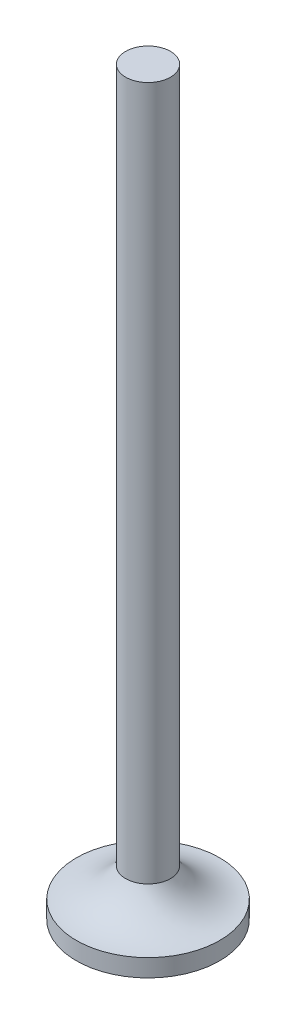
ISO-10303-21;
HEADER;
FILE_DESCRIPTION(('STEP AP214'),'2;1');
FILE_NAME('part.step','',(''),(''),'','','');
FILE_SCHEMA(('AUTOMOTIVE_DESIGN { 1 0 10303 214 1 1 1 1 }'));
ENDSEC;
DATA;
#1=APPLICATION_CONTEXT('core data for automotive mechanical design processes');
#2=APPLICATION_PROTOCOL_DEFINITION('international standard','automotive_design',2000,#1);
#3=PRODUCT_CONTEXT('',#1,'mechanical');
#4=PRODUCT('Part','Part','',(#3));
#5=PRODUCT_RELATED_PRODUCT_CATEGORY('part','',(#4));
#6=PRODUCT_DEFINITION_FORMATION('','',#4);
#7=PRODUCT_DEFINITION_CONTEXT('part definition',#1,'design');
#8=PRODUCT_DEFINITION('design','',#6,#7);
#9=PRODUCT_DEFINITION_SHAPE('','',#8);
#10=(LENGTH_UNIT() NAMED_UNIT(*) SI_UNIT(.MILLI.,.METRE.));
#11=(NAMED_UNIT(*) PLANE_ANGLE_UNIT() SI_UNIT($,.RADIAN.));
#12=(NAMED_UNIT(*) SI_UNIT($,.STERADIAN.) SOLID_ANGLE_UNIT());
#13=UNCERTAINTY_MEASURE_WITH_UNIT(LENGTH_MEASURE(1.E-05),#10,'distance_accuracy_value','');
#14=(GEOMETRIC_REPRESENTATION_CONTEXT(3) GLOBAL_UNCERTAINTY_ASSIGNED_CONTEXT((#13)) GLOBAL_UNIT_ASSIGNED_CONTEXT((#10,
#11,#12)) REPRESENTATION_CONTEXT('',''));
#15=CARTESIAN_POINT('',(0.,0.,0.));
#16=DIRECTION('',(0.,0.,1.));
#17=DIRECTION('',(1.,0.,0.));
#18=AXIS2_PLACEMENT_3D('',#15,#16,#17);
#19=CARTESIAN_POINT('',(3.175,105.,0.));
#20=DIRECTION('',(0.,1.,0.));
#21=DIRECTION('',(0.,0.,1.));
#22=AXIS2_PLACEMENT_3D('',#19,#20,#21);
#23=PLANE('',#22);
#24=CARTESIAN_POINT('',(0.,105.,0.));
#25=DIRECTION('',(0.,-1.,0.));
#26=DIRECTION('',(0.,0.,-1.));
#27=AXIS2_PLACEMENT_3D('',#24,#25,#26);
#28=CIRCLE('',#27,3.175);
#29=CARTESIAN_POINT('',(0.,105.,-3.175));
#30=VERTEX_POINT('',#29);
#31=EDGE_CURVE('E10',#30,#30,#28,.T.);
#32=ORIENTED_EDGE('',*,*,#31,.F.);
#33=EDGE_LOOP('',(#32));
#34=FACE_BOUND('',#33,.T.);
#35=ADVANCED_FACE('F40',(#34),#23,.T.);
#36=CARTESIAN_POINT('',(0.,-31.8317037555853,0.));
#37=DIRECTION('',(0.,-1.,0.));
#38=DIRECTION('',(0.,0.,-1.));
#39=AXIS2_PLACEMENT_3D('',#36,#37,#38);
#40=CYLINDRICAL_SURFACE('',#39,3.175);
#41=ORIENTED_EDGE('',*,*,#31,.T.);
#42=EDGE_LOOP('',(#41));
#43=FACE_BOUND('',#42,.T.);
#44=CARTESIAN_POINT('',(0.,6.60002884626052,0.));
#45=DIRECTION('',(0.,-1.,0.));
#46=DIRECTION('',(0.,0.,-1.));
#47=AXIS2_PLACEMENT_3D('',#44,#45,#46);
#48=CIRCLE('',#47,3.175);
#49=CARTESIAN_POINT('',(0.,6.60002884626052,-3.175));
#50=VERTEX_POINT('',#49);
#51=EDGE_CURVE('E46',#50,#50,#48,.T.);
#52=ORIENTED_EDGE('',*,*,#51,.F.);
#53=EDGE_LOOP('',(#52));
#54=FACE_BOUND('',#53,.T.);
#55=ADVANCED_FACE('F72',(#43,#54),#40,.T.);
#56=CARTESIAN_POINT('',(0.,10.5,0.));
#57=DIRECTION('',(0.,-1.,0.));
#58=DIRECTION('',(0.,0.,-1.));
#59=AXIS2_PLACEMENT_3D('',#56,#57,#58);
#60=TOROIDAL_SURFACE('',#59,10.16,8.);
#61=ORIENTED_EDGE('',*,*,#51,.T.);
#62=EDGE_LOOP('',(#61));
#63=FACE_BOUND('',#62,.T.);
#64=CARTESIAN_POINT('',(0.,2.5,0.));
#65=DIRECTION('',(0.,-1.,0.));
#66=DIRECTION('',(0.,0.,-1.));
#67=AXIS2_PLACEMENT_3D('',#64,#65,#66);
#68=CIRCLE('',#67,10.16);
#69=CARTESIAN_POINT('',(0.,2.5,-10.16));
#70=VERTEX_POINT('',#69);
#71=EDGE_CURVE('E50',#70,#70,#68,.T.);
#72=ORIENTED_EDGE('',*,*,#71,.F.);
#73=EDGE_LOOP('',(#72));
#74=FACE_BOUND('',#73,.T.);
#75=ADVANCED_FACE('F64',(#63,#74),#60,.F.);
#76=CARTESIAN_POINT('',(0.,-31.8317037555853,0.));
#77=DIRECTION('',(0.,-1.,0.));
#78=DIRECTION('',(0.,0.,-1.));
#79=AXIS2_PLACEMENT_3D('',#76,#77,#78);
#80=CYLINDRICAL_SURFACE('',#79,10.16);
#81=ORIENTED_EDGE('',*,*,#71,.T.);
#82=EDGE_LOOP('',(#81));
#83=FACE_BOUND('',#82,.T.);
#84=CARTESIAN_POINT('',(0.,0.,0.));
#85=DIRECTION('',(0.,-1.,0.));
#86=DIRECTION('',(0.,0.,-1.));
#87=AXIS2_PLACEMENT_3D('',#84,#85,#86);
#88=CIRCLE('',#87,10.16);
#89=CARTESIAN_POINT('',(0.,0.,-10.16));
#90=VERTEX_POINT('',#89);
#91=EDGE_CURVE('E54',#90,#90,#88,.T.);
#92=ORIENTED_EDGE('',*,*,#91,.F.);
#93=EDGE_LOOP('',(#92));
#94=FACE_BOUND('',#93,.T.);
#95=ADVANCED_FACE('F62',(#83,#94),#80,.T.);
#96=CARTESIAN_POINT('',(0.,0.,0.));
#97=DIRECTION('',(0.,-1.,0.));
#98=DIRECTION('',(0.,0.,-1.));
#99=AXIS2_PLACEMENT_3D('',#96,#97,#98);
#100=PLANE('',#99);
#101=ORIENTED_EDGE('',*,*,#91,.T.);
#102=EDGE_LOOP('',(#101));
#103=FACE_BOUND('',#102,.T.);
#104=ADVANCED_FACE('F60',(#103),#100,.T.);
#105=CLOSED_SHELL('',(#35,#55,#75,#95,#104));
#106=MANIFOLD_SOLID_BREP('B2',#105);
#107=ADVANCED_BREP_SHAPE_REPRESENTATION('',(#18,#106),#14);
#108=SHAPE_DEFINITION_REPRESENTATION(#9,#107);
ENDSEC;
END-ISO-10303-21;
